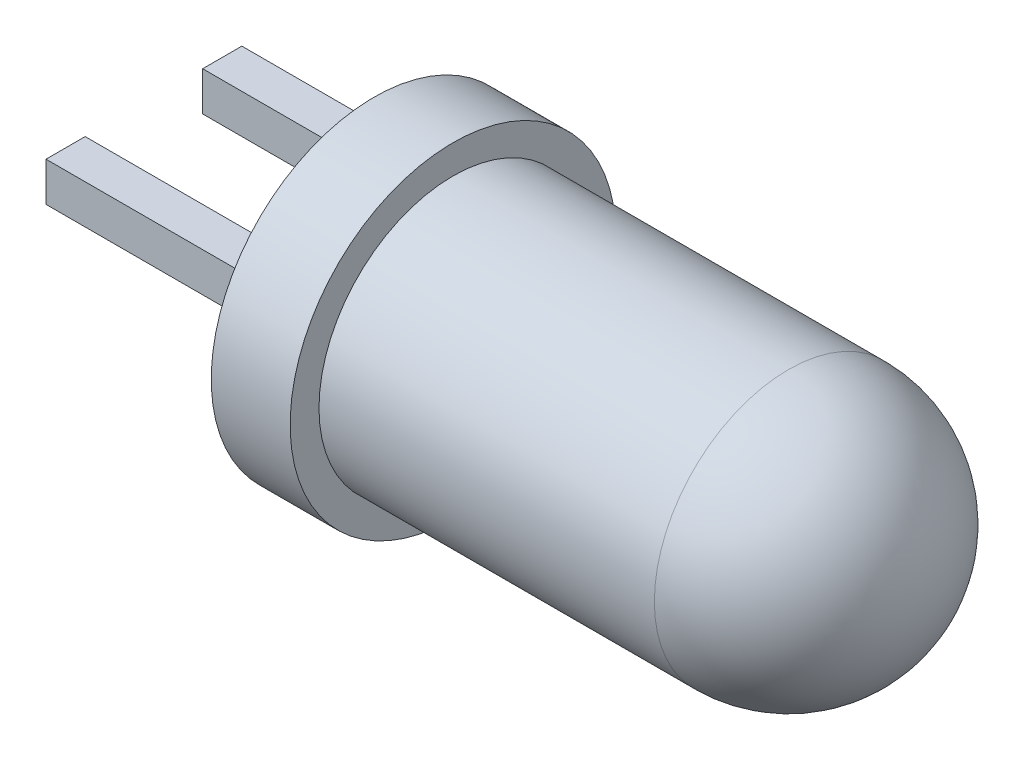
ISO-10303-21;
HEADER;
FILE_DESCRIPTION(('STEP AP214'),'2;1');
FILE_NAME('part.step','',(''),(''),'','','');
FILE_SCHEMA(('AUTOMOTIVE_DESIGN { 1 0 10303 214 1 1 1 1 }'));
ENDSEC;
DATA;
#1=APPLICATION_CONTEXT('core data for automotive mechanical design processes');
#2=APPLICATION_PROTOCOL_DEFINITION('international standard','automotive_design',2000,#1);
#3=PRODUCT_CONTEXT('',#1,'mechanical');
#4=PRODUCT('Part','Part','',(#3));
#5=PRODUCT_RELATED_PRODUCT_CATEGORY('part','',(#4));
#6=PRODUCT_DEFINITION_FORMATION('','',#4);
#7=PRODUCT_DEFINITION_CONTEXT('part definition',#1,'design');
#8=PRODUCT_DEFINITION('design','',#6,#7);
#9=PRODUCT_DEFINITION_SHAPE('','',#8);
#10=(LENGTH_UNIT() NAMED_UNIT(*) SI_UNIT(.MILLI.,.METRE.));
#11=(NAMED_UNIT(*) PLANE_ANGLE_UNIT() SI_UNIT($,.RADIAN.));
#12=(NAMED_UNIT(*) SI_UNIT($,.STERADIAN.) SOLID_ANGLE_UNIT());
#13=UNCERTAINTY_MEASURE_WITH_UNIT(LENGTH_MEASURE(1.E-05),#10,'distance_accuracy_value','');
#14=(GEOMETRIC_REPRESENTATION_CONTEXT(3) GLOBAL_UNCERTAINTY_ASSIGNED_CONTEXT((#13)) GLOBAL_UNIT_ASSIGNED_CONTEXT((#10,
#11,#12)) REPRESENTATION_CONTEXT('',''));
#15=CARTESIAN_POINT('',(0.,0.,0.));
#16=DIRECTION('',(0.,0.,1.));
#17=DIRECTION('',(1.,0.,0.));
#18=AXIS2_PLACEMENT_3D('',#15,#16,#17);
#19=CARTESIAN_POINT('',(41.556948453361,127.506480985467,119.215722179506));
#20=DIRECTION('',(1.,0.,0.));
#21=DIRECTION('',(0.,-1.,0.));
#22=AXIS2_PLACEMENT_3D('',#19,#20,#21);
#23=SPHERICAL_SURFACE('',#22,1.49907626306919);
#24=CARTESIAN_POINT('',(41.556948453361,127.506480985467,119.215722179506));
#25=DIRECTION('',(1.,0.,0.));
#26=DIRECTION('',(0.,-1.,0.));
#27=AXIS2_PLACEMENT_3D('',#24,#25,#26);
#28=CIRCLE('',#27,1.49907626306919);
#29=CARTESIAN_POINT('',(41.556948453361,127.506480985467,117.716645916437));
#30=VERTEX_POINT('',#29);
#31=CARTESIAN_POINT('',(41.556948453361,129.005557248536,119.215722179506));
#32=VERTEX_POINT('',#31);
#33=EDGE_CURVE('P0_E66',#30,#32,#28,.T.);
#34=ORIENTED_EDGE('',*,*,#33,.T.);
#35=CARTESIAN_POINT('',(41.556948453361,127.506480985467,119.215722179506));
#36=DIRECTION('',(0.,0.,1.));
#37=DIRECTION('',(0.,1.,0.));
#38=AXIS2_PLACEMENT_3D('',#35,#36,#37);
#39=CIRCLE('',#38,1.4990762630692);
#40=CARTESIAN_POINT('',(43.0560247164302,127.506480985467,119.215722179506));
#41=VERTEX_POINT('',#40);
#42=EDGE_CURVE('P0_E11',#41,#32,#39,.T.);
#43=ORIENTED_EDGE('',*,*,#42,.F.);
#44=ORIENTED_EDGE('',*,*,#42,.T.);
#45=CARTESIAN_POINT('',(41.556948453361,127.506480985467,119.215722179506));
#46=DIRECTION('',(1.,0.,0.));
#47=DIRECTION('',(0.,-1.,0.));
#48=AXIS2_PLACEMENT_3D('',#45,#46,#47);
#49=CIRCLE('',#48,1.49907626306919);
#50=EDGE_CURVE('P0_E69',#32,#30,#49,.T.);
#51=ORIENTED_EDGE('',*,*,#50,.T.);
#52=EDGE_LOOP('',(#34,#43,#44,#51));
#53=FACE_BOUND('',#52,.T.);
#54=ADVANCED_FACE('P0_F17',(#53),#23,.T.);
#55=CARTESIAN_POINT('',(36.9246378551164,127.506480985467,120.126510111259));
#56=DIRECTION('',(1.,0.,0.));
#57=DIRECTION('',(0.,1.,0.));
#58=AXIS2_PLACEMENT_3D('',#55,#56,#57);
#59=PLANE('',#58);
#60=CARTESIAN_POINT('',(36.9246378551164,127.506480985467,119.215722179506));
#61=DIRECTION('',(1.,0.,0.));
#62=DIRECTION('',(0.,0.,1.));
#63=AXIS2_PLACEMENT_3D('',#60,#61,#62);
#64=CIRCLE('',#63,1.82157586350626);
#65=CARTESIAN_POINT('',(36.9246378551164,127.506480985467,117.394146316));
#66=VERTEX_POINT('',#65);
#67=EDGE_CURVE('P0_E84',#66,#66,#64,.T.);
#68=ORIENTED_EDGE('',*,*,#67,.F.);
#69=EDGE_LOOP('',(#68));
#70=FACE_BOUND('',#69,.T.);
#71=ADVANCED_FACE('P0_F104',(#70),#59,.F.);
#72=CARTESIAN_POINT('',(37.3657203700613,127.506480985467,119.215722179506));
#73=DIRECTION('',(-1.,0.,0.));
#74=DIRECTION('',(0.,0.,1.));
#75=AXIS2_PLACEMENT_3D('',#72,#73,#74);
#76=CYLINDRICAL_SURFACE('',#75,1.82157586350626);
#77=ORIENTED_EDGE('',*,*,#67,.T.);
#78=DIRECTION('',(1.,0.,0.));
#79=VECTOR('',#78,1.);
#80=CARTESIAN_POINT('',(37.3657203700613,127.506480985467,117.394146316));
#81=LINE('',#80,#79);
#82=CARTESIAN_POINT('',(37.8068028850063,127.506480985467,117.394146316));
#83=VERTEX_POINT('',#82);
#84=EDGE_CURVE('P0_E20',#66,#83,#81,.T.);
#85=ORIENTED_EDGE('',*,*,#84,.T.);
#86=CARTESIAN_POINT('',(37.8068028850063,127.506480985467,119.215722179506));
#87=DIRECTION('',(1.,0.,0.));
#88=DIRECTION('',(0.,0.,1.));
#89=AXIS2_PLACEMENT_3D('',#86,#87,#88);
#90=CIRCLE('',#89,1.82157586350626);
#91=EDGE_CURVE('P0_E81',#83,#83,#90,.T.);
#92=ORIENTED_EDGE('',*,*,#91,.F.);
#93=ORIENTED_EDGE('',*,*,#84,.F.);
#94=EDGE_LOOP('',(#77,#85,#92,#93));
#95=FACE_BOUND('',#94,.T.);
#96=ADVANCED_FACE('P0_F92',(#95),#76,.T.);
#97=CARTESIAN_POINT('',(37.8068028850063,127.506480985467,120.876048242794));
#98=DIRECTION('',(-1.,0.,0.));
#99=DIRECTION('',(0.,0.,1.));
#100=AXIS2_PLACEMENT_3D('',#97,#98,#99);
#101=PLANE('',#100);
#102=CARTESIAN_POINT('',(37.8068028850063,127.506480985467,119.215722179506));
#103=DIRECTION('',(1.,0.,0.));
#104=DIRECTION('',(0.,0.,1.));
#105=AXIS2_PLACEMENT_3D('',#102,#103,#104);
#106=CIRCLE('',#105,1.49907626306918);
#107=CARTESIAN_POINT('',(37.8068028850063,127.506480985467,117.716645916437));
#108=VERTEX_POINT('',#107);
#109=EDGE_CURVE('P0_E64',#108,#108,#106,.T.);
#110=ORIENTED_EDGE('',*,*,#109,.F.);
#111=EDGE_LOOP('',(#110));
#112=FACE_BOUND('',#111,.T.);
#113=ORIENTED_EDGE('',*,*,#91,.T.);
#114=EDGE_LOOP('',(#113));
#115=FACE_BOUND('',#114,.T.);
#116=ADVANCED_FACE('P0_F94',(#112,#115),#101,.F.);
#117=CARTESIAN_POINT('',(39.6818756691836,127.506480985467,119.215722179506));
#118=DIRECTION('',(-1.,0.,0.));
#119=DIRECTION('',(0.,0.,1.));
#120=AXIS2_PLACEMENT_3D('',#117,#118,#119);
#121=CYLINDRICAL_SURFACE('',#120,1.49907626306918);
#122=ORIENTED_EDGE('',*,*,#109,.T.);
#123=DIRECTION('',(1.,0.,0.));
#124=VECTOR('',#123,1.);
#125=CARTESIAN_POINT('',(39.6818756691836,127.506480985467,117.716645916437));
#126=LINE('',#125,#124);
#127=EDGE_CURVE('P0_E61',#108,#30,#126,.T.);
#128=ORIENTED_EDGE('',*,*,#127,.T.);
#129=ORIENTED_EDGE('',*,*,#50,.F.);
#130=ORIENTED_EDGE('',*,*,#33,.F.);
#131=ORIENTED_EDGE('',*,*,#127,.F.);
#132=EDGE_LOOP('',(#122,#128,#129,#130,#131));
#133=FACE_BOUND('',#132,.T.);
#134=ADVANCED_FACE('P0_F62',(#133),#121,.T.);
#135=CLOSED_SHELL('',(#54,#71,#96,#116,#134));
#136=MANIFOLD_SOLID_BREP('P0_B1',#135);
#137=CARTESIAN_POINT('',(35.643783620503,127.363942335767,119.800951466132));
#138=DIRECTION('',(0.,-1.,0.));
#139=DIRECTION('',(0.,0.,-1.));
#140=AXIS2_PLACEMENT_3D('',#137,#138,#139);
#141=PLANE('',#140);
#142=DIRECTION('',(1.,0.,0.));
#143=VECTOR('',#142,1.);
#144=CARTESIAN_POINT('',(35.643783620503,127.363942335767,119.687669134371));
#145=LINE('',#144,#143);
#146=CARTESIAN_POINT('',(34.1652583239528,127.363942335767,119.687669134371));
#147=VERTEX_POINT('',#146);
#148=CARTESIAN_POINT('',(38.176257537891,127.363942335767,119.687669134371));
#149=VERTEX_POINT('',#148);
#150=EDGE_CURVE('P1_E11',#147,#149,#145,.T.);
#151=ORIENTED_EDGE('',*,*,#150,.T.);
#152=DIRECTION('',(0.,0.,1.));
#153=VECTOR('',#152,1.);
#154=CARTESIAN_POINT('',(38.176257537891,127.363942335767,119.034528108468));
#155=LINE('',#154,#153);
#156=CARTESIAN_POINT('',(38.176257537891,127.363942335767,119.352734373898));
#157=VERTEX_POINT('',#156);
#158=EDGE_CURVE('P1_E143',#157,#149,#155,.T.);
#159=ORIENTED_EDGE('',*,*,#158,.F.);
#160=DIRECTION('',(-0.772727558068304,0.,-0.634737836434694));
#161=VECTOR('',#160,1.);
#162=CARTESIAN_POINT('',(39.063046113489,127.363942335767,120.08116479672));
#163=LINE('',#162,#161);
#164=CARTESIAN_POINT('',(38.939781138572,127.363942335767,119.97991184842));
#165=VERTEX_POINT('',#164);
#166=EDGE_CURVE('P1_E26',#165,#157,#163,.T.);
#167=ORIENTED_EDGE('',*,*,#166,.F.);
#168=DIRECTION('',(1.,0.,0.));
#169=VECTOR('',#168,1.);
#170=CARTESIAN_POINT('',(38.629471215827,127.363942335767,119.97991184842));
#171=LINE('',#170,#169);
#172=CARTESIAN_POINT('',(39.34696797288,127.363942335767,119.97991184842));
#173=VERTEX_POINT('',#172);
#174=EDGE_CURVE('P1_E109',#165,#173,#171,.T.);
#175=ORIENTED_EDGE('',*,*,#174,.T.);
#176=DIRECTION('',(0.,0.,-1.));
#177=VECTOR('',#176,1.);
#178=CARTESIAN_POINT('',(39.34696797288,127.363942335767,120.528882713542));
#179=LINE('',#178,#177);
#180=CARTESIAN_POINT('',(39.34696797288,127.363942335767,120.382400068216));
#181=VERTEX_POINT('',#180);
#182=EDGE_CURVE('P1_E50',#181,#173,#179,.T.);
#183=ORIENTED_EDGE('',*,*,#182,.F.);
#184=DIRECTION('',(1.,0.,0.));
#185=VECTOR('',#184,1.);
#186=CARTESIAN_POINT('',(38.357006095456,127.363942335767,120.382400068216));
#187=LINE('',#186,#185);
#188=CARTESIAN_POINT('',(38.357006095456,127.363942335767,120.382400068216));
#189=VERTEX_POINT('',#188);
#190=EDGE_CURVE('P1_E106',#189,#181,#187,.T.);
#191=ORIENTED_EDGE('',*,*,#190,.F.);
#192=DIRECTION('',(-0.772727558068304,0.,-0.634737836434694));
#193=VECTOR('',#192,1.);
#194=CARTESIAN_POINT('',(38.480271070373,127.363942335767,120.483653016516));
#195=LINE('',#194,#193);
#196=CARTESIAN_POINT('',(38.044409463769,127.363942335767,120.12562533875));
#197=VERTEX_POINT('',#196);
#198=EDGE_CURVE('P1_E112',#189,#197,#195,.T.);
#199=ORIENTED_EDGE('',*,*,#198,.T.);
#200=DIRECTION('',(1.,0.,0.));
#201=VECTOR('',#200,1.);
#202=CARTESIAN_POINT('',(35.643783620503,127.363942335767,120.12562533875));
#203=LINE('',#202,#201);
#204=CARTESIAN_POINT('',(34.1652583239528,127.363942335767,120.12562533875));
#205=VERTEX_POINT('',#204);
#206=EDGE_CURVE('P1_E137',#205,#197,#203,.T.);
#207=ORIENTED_EDGE('',*,*,#206,.F.);
#208=DIRECTION('',(0.,0.,1.));
#209=VECTOR('',#208,1.);
#210=CARTESIAN_POINT('',(34.1652583239528,127.363942335767,119.963288402441));
#211=LINE('',#210,#209);
#212=EDGE_CURVE('P1_E216',#147,#205,#211,.T.);
#213=ORIENTED_EDGE('',*,*,#212,.F.);
#214=EDGE_LOOP('',(#151,#159,#167,#175,#183,#191,#199,#207,#213));
#215=FACE_BOUND('',#214,.T.);
#216=ADVANCED_FACE('P1_F17',(#215),#141,.T.);
#217=CARTESIAN_POINT('',(36.918952053102,127.582920437956,119.687669134371));
#218=DIRECTION('',(0.,0.,-1.));
#219=DIRECTION('',(0.,-1.,0.));
#220=AXIS2_PLACEMENT_3D('',#217,#218,#219);
#221=PLANE('',#220);
#222=DIRECTION('',(-1.,0.,0.));
#223=VECTOR('',#222,1.);
#224=CARTESIAN_POINT('',(35.643783620503,127.801898540146,119.687669134371));
#225=LINE('',#224,#223);
#226=CARTESIAN_POINT('',(38.176257537891,127.801898540146,119.687669134371));
#227=VERTEX_POINT('',#226);
#228=CARTESIAN_POINT('',(34.1652583239528,127.801898540146,119.687669134371));
#229=VERTEX_POINT('',#228);
#230=EDGE_CURVE('P1_E174',#227,#229,#225,.T.);
#231=ORIENTED_EDGE('',*,*,#230,.F.);
#232=DIRECTION('',(0.,1.,0.));
#233=VECTOR('',#232,1.);
#234=CARTESIAN_POINT('',(38.176257537891,127.582920437956,119.687669134371));
#235=LINE('',#234,#233);
#236=EDGE_CURVE('P1_E147',#149,#227,#235,.T.);
#237=ORIENTED_EDGE('',*,*,#236,.F.);
#238=ORIENTED_EDGE('',*,*,#150,.F.);
#239=DIRECTION('',(0.,-1.,0.));
#240=VECTOR('',#239,1.);
#241=CARTESIAN_POINT('',(34.1652583239528,127.582920437956,119.687669134371));
#242=LINE('',#241,#240);
#243=EDGE_CURVE('P1_E213',#229,#147,#242,.T.);
#244=ORIENTED_EDGE('',*,*,#243,.F.);
#245=EDGE_LOOP('',(#231,#237,#238,#244));
#246=FACE_BOUND('',#245,.T.);
#247=ADVANCED_FACE('P1_F283',(#246),#221,.T.);
#248=CARTESIAN_POINT('',(38.939781138572,127.582920437956,119.97991184842));
#249=DIRECTION('',(0.634737836434694,0.,-0.772727558068304));
#250=DIRECTION('',(0.,-1.,0.));
#251=AXIS2_PLACEMENT_3D('',#248,#249,#250);
#252=PLANE('',#251);
#253=DIRECTION('',(0.,1.,0.));
#254=VECTOR('',#253,1.);
#255=CARTESIAN_POINT('',(38.939781138572,127.582920437956,119.97991184842));
#256=LINE('',#255,#254);
#257=CARTESIAN_POINT('',(38.939781138572,127.801898540146,119.97991184842));
#258=VERTEX_POINT('',#257);
#259=EDGE_CURVE('P1_E153',#165,#258,#256,.T.);
#260=ORIENTED_EDGE('',*,*,#259,.F.);
#261=ORIENTED_EDGE('',*,*,#166,.T.);
#262=DIRECTION('',(0.,1.,0.));
#263=VECTOR('',#262,1.);
#264=CARTESIAN_POINT('',(38.176257537891,127.582920437956,119.352734373898));
#265=LINE('',#264,#263);
#266=CARTESIAN_POINT('',(38.176257537891,127.801898540146,119.352734373898));
#267=VERTEX_POINT('',#266);
#268=EDGE_CURVE('P1_E122',#157,#267,#265,.T.);
#269=ORIENTED_EDGE('',*,*,#268,.T.);
#270=DIRECTION('',(-0.772727558068304,0.,-0.634737836434694));
#271=VECTOR('',#270,1.);
#272=CARTESIAN_POINT('',(39.063046113489,127.801898540146,120.08116479672));
#273=LINE('',#272,#271);
#274=EDGE_CURVE('P1_E175',#258,#267,#273,.T.);
#275=ORIENTED_EDGE('',*,*,#274,.F.);
#276=EDGE_LOOP('',(#260,#261,#269,#275));
#277=FACE_BOUND('',#276,.T.);
#278=ADVANCED_FACE('P1_F19',(#277),#252,.T.);
#279=CARTESIAN_POINT('',(39.34696797288,127.582920437956,119.97991184842));
#280=DIRECTION('',(1.,0.,0.));
#281=DIRECTION('',(0.,1.,0.));
#282=AXIS2_PLACEMENT_3D('',#279,#280,#281);
#283=PLANE('',#282);
#284=DIRECTION('',(0.,-1.,0.));
#285=VECTOR('',#284,1.);
#286=CARTESIAN_POINT('',(39.34696797288,127.582920437956,119.97991184842));
#287=LINE('',#286,#285);
#288=CARTESIAN_POINT('',(39.34696797288,127.801898540146,119.97991184842));
#289=VERTEX_POINT('',#288);
#290=EDGE_CURVE('P1_E148',#289,#173,#287,.T.);
#291=ORIENTED_EDGE('',*,*,#290,.F.);
#292=DIRECTION('',(0.,0.,-1.));
#293=VECTOR('',#292,1.);
#294=CARTESIAN_POINT('',(39.34696797288,127.801898540146,120.528882713542));
#295=LINE('',#294,#293);
#296=CARTESIAN_POINT('',(39.34696797288,127.801898540146,120.382400068216));
#297=VERTEX_POINT('',#296);
#298=EDGE_CURVE('P1_E126',#297,#289,#295,.T.);
#299=ORIENTED_EDGE('',*,*,#298,.F.);
#300=DIRECTION('',(0.,1.,0.));
#301=VECTOR('',#300,1.);
#302=CARTESIAN_POINT('',(39.34696797288,127.582920437956,120.382400068216));
#303=LINE('',#302,#301);
#304=EDGE_CURVE('P1_E117',#181,#297,#303,.T.);
#305=ORIENTED_EDGE('',*,*,#304,.F.);
#306=ORIENTED_EDGE('',*,*,#182,.T.);
#307=EDGE_LOOP('',(#291,#299,#305,#306));
#308=FACE_BOUND('',#307,.T.);
#309=ADVANCED_FACE('P1_F124',(#308),#283,.T.);
#310=CARTESIAN_POINT('',(38.357006095456,127.582920437956,120.382400068216));
#311=DIRECTION('',(-0.634737836434694,0.,0.772727558068304));
#312=DIRECTION('',(0.,1.,0.));
#313=AXIS2_PLACEMENT_3D('',#310,#311,#312);
#314=PLANE('',#313);
#315=DIRECTION('',(0.,-1.,0.));
#316=VECTOR('',#315,1.);
#317=CARTESIAN_POINT('',(38.357006095456,127.582920437956,120.382400068216));
#318=LINE('',#317,#316);
#319=CARTESIAN_POINT('',(38.357006095456,127.801898540146,120.382400068216));
#320=VERTEX_POINT('',#319);
#321=EDGE_CURVE('P1_E120',#320,#189,#318,.T.);
#322=ORIENTED_EDGE('',*,*,#321,.F.);
#323=DIRECTION('',(-0.772727558068304,0.,-0.634737836434694));
#324=VECTOR('',#323,1.);
#325=CARTESIAN_POINT('',(38.480271070373,127.801898540146,120.483653016516));
#326=LINE('',#325,#324);
#327=CARTESIAN_POINT('',(38.044409463769,127.801898540146,120.12562533875));
#328=VERTEX_POINT('',#327);
#329=EDGE_CURVE('P1_E222',#320,#328,#326,.T.);
#330=ORIENTED_EDGE('',*,*,#329,.T.);
#331=DIRECTION('',(0.,1.,0.));
#332=VECTOR('',#331,1.);
#333=CARTESIAN_POINT('',(38.044409463769,127.582920437956,120.12562533875));
#334=LINE('',#333,#332);
#335=EDGE_CURVE('P1_E129',#197,#328,#334,.T.);
#336=ORIENTED_EDGE('',*,*,#335,.F.);
#337=ORIENTED_EDGE('',*,*,#198,.F.);
#338=EDGE_LOOP('',(#322,#330,#336,#337));
#339=FACE_BOUND('',#338,.T.);
#340=ADVANCED_FACE('P1_F272',(#339),#314,.T.);
#341=CARTESIAN_POINT('',(39.34696797288,127.582920437956,119.97991184842));
#342=DIRECTION('',(0.,0.,-1.));
#343=DIRECTION('',(0.,-1.,0.));
#344=AXIS2_PLACEMENT_3D('',#341,#342,#343);
#345=PLANE('',#344);
#346=ORIENTED_EDGE('',*,*,#290,.T.);
#347=ORIENTED_EDGE('',*,*,#174,.F.);
#348=ORIENTED_EDGE('',*,*,#259,.T.);
#349=DIRECTION('',(1.,0.,0.));
#350=VECTOR('',#349,1.);
#351=CARTESIAN_POINT('',(38.629471215827,127.801898540146,119.97991184842));
#352=LINE('',#351,#350);
#353=EDGE_CURVE('P1_E181',#258,#289,#352,.T.);
#354=ORIENTED_EDGE('',*,*,#353,.T.);
#355=EDGE_LOOP('',(#346,#347,#348,#354));
#356=FACE_BOUND('',#355,.T.);
#357=ADVANCED_FACE('P1_F303',(#356),#345,.T.);
#358=CARTESIAN_POINT('',(38.176257537891,127.582920437956,119.352734373898));
#359=DIRECTION('',(-1.,0.,0.));
#360=DIRECTION('',(0.,0.,1.));
#361=AXIS2_PLACEMENT_3D('',#358,#359,#360);
#362=PLANE('',#361);
#363=ORIENTED_EDGE('',*,*,#268,.F.);
#364=ORIENTED_EDGE('',*,*,#158,.T.);
#365=ORIENTED_EDGE('',*,*,#236,.T.);
#366=DIRECTION('',(0.,0.,1.));
#367=VECTOR('',#366,1.);
#368=CARTESIAN_POINT('',(38.176257537891,127.801898540146,119.034528108468));
#369=LINE('',#368,#367);
#370=EDGE_CURVE('P1_E169',#267,#227,#369,.T.);
#371=ORIENTED_EDGE('',*,*,#370,.F.);
#372=EDGE_LOOP('',(#363,#364,#365,#371));
#373=FACE_BOUND('',#372,.T.);
#374=ADVANCED_FACE('P1_F167',(#373),#362,.T.);
#375=CARTESIAN_POINT('',(39.34696797288,127.582920437956,120.382400068216));
#376=DIRECTION('',(0.,0.,1.));
#377=DIRECTION('',(1.,0.,0.));
#378=AXIS2_PLACEMENT_3D('',#375,#376,#377);
#379=PLANE('',#378);
#380=ORIENTED_EDGE('',*,*,#304,.T.);
#381=DIRECTION('',(1.,0.,0.));
#382=VECTOR('',#381,1.);
#383=CARTESIAN_POINT('',(38.357006095456,127.801898540146,120.382400068216));
#384=LINE('',#383,#382);
#385=EDGE_CURVE('P1_E225',#320,#297,#384,.T.);
#386=ORIENTED_EDGE('',*,*,#385,.F.);
#387=ORIENTED_EDGE('',*,*,#321,.T.);
#388=ORIENTED_EDGE('',*,*,#190,.T.);
#389=EDGE_LOOP('',(#380,#386,#387,#388));
#390=FACE_BOUND('',#389,.T.);
#391=ADVANCED_FACE('P1_F115',(#390),#379,.T.);
#392=CARTESIAN_POINT('',(38.044409463769,127.582920437956,120.12562533875));
#393=DIRECTION('',(0.,0.,1.));
#394=DIRECTION('',(1.,0.,0.));
#395=AXIS2_PLACEMENT_3D('',#392,#393,#394);
#396=PLANE('',#395);
#397=ORIENTED_EDGE('',*,*,#206,.T.);
#398=ORIENTED_EDGE('',*,*,#335,.T.);
#399=DIRECTION('',(1.,0.,0.));
#400=VECTOR('',#399,1.);
#401=CARTESIAN_POINT('',(35.643783620503,127.801898540146,120.12562533875));
#402=LINE('',#401,#400);
#403=CARTESIAN_POINT('',(34.1652583239528,127.801898540146,120.12562533875));
#404=VERTEX_POINT('',#403);
#405=EDGE_CURVE('P1_E221',#404,#328,#402,.T.);
#406=ORIENTED_EDGE('',*,*,#405,.F.);
#407=DIRECTION('',(0.,1.,0.));
#408=VECTOR('',#407,1.);
#409=CARTESIAN_POINT('',(34.1652583239528,127.582920437956,120.12562533875));
#410=LINE('',#409,#408);
#411=EDGE_CURVE('P1_E205',#205,#404,#410,.T.);
#412=ORIENTED_EDGE('',*,*,#411,.F.);
#413=EDGE_LOOP('',(#397,#398,#406,#412));
#414=FACE_BOUND('',#413,.T.);
#415=ADVANCED_FACE('P1_F269',(#414),#396,.T.);
#416=CARTESIAN_POINT('',(35.643783620503,127.801898540146,119.800951466132));
#417=DIRECTION('',(0.,-1.,0.));
#418=DIRECTION('',(0.,0.,-1.));
#419=AXIS2_PLACEMENT_3D('',#416,#417,#418);
#420=PLANE('',#419);
#421=ORIENTED_EDGE('',*,*,#405,.T.);
#422=ORIENTED_EDGE('',*,*,#329,.F.);
#423=ORIENTED_EDGE('',*,*,#385,.T.);
#424=ORIENTED_EDGE('',*,*,#298,.T.);
#425=ORIENTED_EDGE('',*,*,#353,.F.);
#426=ORIENTED_EDGE('',*,*,#274,.T.);
#427=ORIENTED_EDGE('',*,*,#370,.T.);
#428=ORIENTED_EDGE('',*,*,#230,.T.);
#429=DIRECTION('',(0.,0.,-1.));
#430=VECTOR('',#429,1.);
#431=CARTESIAN_POINT('',(34.1652583239528,127.801898540146,119.963288402441));
#432=LINE('',#431,#430);
#433=EDGE_CURVE('P1_E209',#404,#229,#432,.T.);
#434=ORIENTED_EDGE('',*,*,#433,.F.);
#435=EDGE_LOOP('',(#421,#422,#423,#424,#425,#426,#427,#428,#434));
#436=FACE_BOUND('',#435,.T.);
#437=ADVANCED_FACE('P1_F179',(#436),#420,.F.);
#438=CARTESIAN_POINT('',(34.1652583239528,127.582920437956,120.12562533875));
#439=DIRECTION('',(-1.,0.,0.));
#440=DIRECTION('',(0.,0.,1.));
#441=AXIS2_PLACEMENT_3D('',#438,#439,#440);
#442=PLANE('',#441);
#443=ORIENTED_EDGE('',*,*,#411,.T.);
#444=ORIENTED_EDGE('',*,*,#433,.T.);
#445=ORIENTED_EDGE('',*,*,#243,.T.);
#446=ORIENTED_EDGE('',*,*,#212,.T.);
#447=EDGE_LOOP('',(#443,#444,#445,#446));
#448=FACE_BOUND('',#447,.T.);
#449=ADVANCED_FACE('P1_F281',(#448),#442,.T.);
#450=CLOSED_SHELL('',(#216,#247,#278,#309,#340,#357,#374,#391,#415,#437,#449));
#451=MANIFOLD_SOLID_BREP('P1_B1',#450);
#452=CARTESIAN_POINT('',(34.1652583239528,127.582920437956,120.12562533875));
#453=DIRECTION('',(-1.,0.,0.));
#454=DIRECTION('',(0.,0.,1.));
#455=AXIS2_PLACEMENT_3D('',#452,#453,#454);
#456=PLANE('',#455);
#457=DIRECTION('',(0.,1.,0.));
#458=VECTOR('',#457,1.);
#459=CARTESIAN_POINT('',(34.1652583239528,127.582920437956,118.373800521232));
#460=LINE('',#459,#458);
#461=CARTESIAN_POINT('',(34.1652583239528,127.363942335767,118.373800521232));
#462=VERTEX_POINT('',#461);
#463=CARTESIAN_POINT('',(34.1652583239528,127.801898540146,118.373800521232));
#464=VERTEX_POINT('',#463);
#465=EDGE_CURVE('P2_E11',#462,#464,#460,.T.);
#466=ORIENTED_EDGE('',*,*,#465,.T.);
#467=DIRECTION('',(0.,0.,-1.));
#468=VECTOR('',#467,1.);
#469=CARTESIAN_POINT('',(34.1652583239528,127.801898540146,119.087375993682));
#470=LINE('',#469,#468);
#471=CARTESIAN_POINT('',(34.1652583239528,127.801898540146,117.935844316853));
#472=VERTEX_POINT('',#471);
#473=EDGE_CURVE('P2_E127',#464,#472,#470,.T.);
#474=ORIENTED_EDGE('',*,*,#473,.T.);
#475=DIRECTION('',(0.,-1.,0.));
#476=VECTOR('',#475,1.);
#477=CARTESIAN_POINT('',(34.1652583239528,127.582920437956,117.935844316853));
#478=LINE('',#477,#476);
#479=CARTESIAN_POINT('',(34.1652583239528,127.363942335767,117.935844316853));
#480=VERTEX_POINT('',#479);
#481=EDGE_CURVE('P2_E177',#472,#480,#478,.T.);
#482=ORIENTED_EDGE('',*,*,#481,.T.);
#483=DIRECTION('',(0.,0.,1.));
#484=VECTOR('',#483,1.);
#485=CARTESIAN_POINT('',(34.1652583239528,127.363942335767,119.087375993682));
#486=LINE('',#485,#484);
#487=EDGE_CURVE('P2_E170',#480,#462,#486,.T.);
#488=ORIENTED_EDGE('',*,*,#487,.T.);
#489=EDGE_LOOP('',(#466,#474,#482,#488));
#490=FACE_BOUND('',#489,.T.);
#491=ADVANCED_FACE('P2_F17',(#490),#456,.T.);
#492=CARTESIAN_POINT('',(35.123009343903,127.363942335767,118.373800521232));
#493=DIRECTION('',(0.,0.,1.));
#494=DIRECTION('',(1.,0.,0.));
#495=AXIS2_PLACEMENT_3D('',#492,#493,#494);
#496=PLANE('',#495);
#497=DIRECTION('',(-1.,0.,0.));
#498=VECTOR('',#497,1.);
#499=CARTESIAN_POINT('',(35.123009343903,127.801898540146,118.373800521232));
#500=LINE('',#499,#498);
#501=CARTESIAN_POINT('',(38.176257537891,127.801898540146,118.373800521232));
#502=VERTEX_POINT('',#501);
#503=EDGE_CURVE('P2_E26',#502,#464,#500,.T.);
#504=ORIENTED_EDGE('',*,*,#503,.T.);
#505=ORIENTED_EDGE('',*,*,#465,.F.);
#506=DIRECTION('',(1.,0.,0.));
#507=VECTOR('',#506,1.);
#508=CARTESIAN_POINT('',(36.629185080357,127.363942335767,118.373800521232));
#509=LINE('',#508,#507);
#510=CARTESIAN_POINT('',(38.176257537891,127.363942335767,118.373800521232));
#511=VERTEX_POINT('',#510);
#512=EDGE_CURVE('P2_E144',#462,#511,#509,.T.);
#513=ORIENTED_EDGE('',*,*,#512,.T.);
#514=DIRECTION('',(0.,-1.,0.));
#515=VECTOR('',#514,1.);
#516=CARTESIAN_POINT('',(38.176257537891,127.582920437956,118.373800521232));
#517=LINE('',#516,#515);
#518=EDGE_CURVE('P2_E136',#502,#511,#517,.T.);
#519=ORIENTED_EDGE('',*,*,#518,.F.);
#520=EDGE_LOOP('',(#504,#505,#513,#519));
#521=FACE_BOUND('',#520,.T.);
#522=ADVANCED_FACE('P2_F19',(#521),#496,.T.);
#523=CARTESIAN_POINT('',(35.123009343903,127.801898540146,118.373800521232));
#524=DIRECTION('',(0.,1.,0.));
#525=DIRECTION('',(1.,0.,0.));
#526=AXIS2_PLACEMENT_3D('',#523,#524,#525);
#527=PLANE('',#526);
#528=DIRECTION('',(-1.,0.,0.));
#529=VECTOR('',#528,1.);
#530=CARTESIAN_POINT('',(35.123009343903,127.801898540146,117.935844316853));
#531=LINE('',#530,#529);
#532=CARTESIAN_POINT('',(38.429623073374,127.801898540146,117.935844316853));
#533=VERTEX_POINT('',#532);
#534=EDGE_CURVE('P2_E179',#533,#472,#531,.T.);
#535=ORIENTED_EDGE('',*,*,#534,.T.);
#536=ORIENTED_EDGE('',*,*,#473,.F.);
#537=ORIENTED_EDGE('',*,*,#503,.F.);
#538=DIRECTION('',(0.,0.,-1.));
#539=VECTOR('',#538,1.);
#540=CARTESIAN_POINT('',(38.176257537891,127.801898540146,119.034528108468));
#541=LINE('',#540,#539);
#542=CARTESIAN_POINT('',(38.176257537891,127.801898540146,119.034528108468));
#543=VERTEX_POINT('',#542);
#544=EDGE_CURVE('P2_E125',#543,#502,#541,.T.);
#545=ORIENTED_EDGE('',*,*,#544,.F.);
#546=DIRECTION('',(-0.772727558068304,0.,-0.634737836434694));
#547=VECTOR('',#546,1.);
#548=CARTESIAN_POINT('',(39.063046113489,127.801898540146,119.76295853129));
#549=LINE('',#548,#547);
#550=CARTESIAN_POINT('',(38.972652930809,127.801898540146,119.68870729927));
#551=VERTEX_POINT('',#550);
#552=EDGE_CURVE('P2_E210',#551,#543,#549,.T.);
#553=ORIENTED_EDGE('',*,*,#552,.F.);
#554=DIRECTION('',(-1.,0.,0.));
#555=VECTOR('',#554,1.);
#556=CARTESIAN_POINT('',(39.692445571535,127.801898540146,119.68870729927));
#557=LINE('',#556,#555);
#558=CARTESIAN_POINT('',(39.063046113489,127.801898540146,119.68870729927));
#559=VERTEX_POINT('',#558);
#560=EDGE_CURVE('P2_E234',#559,#551,#557,.T.);
#561=ORIENTED_EDGE('',*,*,#560,.F.);
#562=DIRECTION('',(0.,0.,-1.));
#563=VECTOR('',#562,1.);
#564=CARTESIAN_POINT('',(39.063046113489,127.801898540146,120.050696124541));
#565=LINE('',#564,#563);
#566=CARTESIAN_POINT('',(39.063046113489,127.801898540146,119.441269270757));
#567=VERTEX_POINT('',#566);
#568=EDGE_CURVE('P2_E164',#559,#567,#565,.T.);
#569=ORIENTED_EDGE('',*,*,#568,.T.);
#570=CARTESIAN_POINT('',(39.063046113489,127.801898540146,119.441269270757));
#571=CARTESIAN_POINT('',(39.050311589243,127.801898540146,119.421479795793));
#572=CARTESIAN_POINT('',(39.037693101015,127.801898540146,119.401616193594));
#573=CARTESIAN_POINT('',(39.025243683415,127.801898540146,119.381647656845));
#574=CARTESIAN_POINT('',(39.01901891558,127.801898540146,119.371663293782));
#575=CARTESIAN_POINT('',(39.012837129213,127.801898540146,119.361653085094));
#576=CARTESIAN_POINT('',(39.00670591019,127.801898540146,119.351608275032));
#577=CARTESIAN_POINT('',(39.000574859648,127.801898540146,119.341563740991));
#578=CARTESIAN_POINT('',(38.994495220536,127.801898540146,119.331486086476));
#579=CARTESIAN_POINT('',(38.988480543401,127.801898540146,119.321370020137));
#580=CARTESIAN_POINT('',(38.982465865341,127.801898540146,119.311253952243));
#581=CARTESIAN_POINT('',(38.976516025587,127.801898540146,119.301099453025));
#582=CARTESIAN_POINT('',(38.970648292664,127.801898540146,119.290898808406));
#583=CARTESIAN_POINT('',(38.964780566557,127.801898540146,119.280698175635));
#584=CARTESIAN_POINT('',(38.958994748791,127.801898540142,119.270451328154));
#585=CARTESIAN_POINT('',(38.953313531937,127.801898540142,119.260147596299));
#586=CARTESIAN_POINT('',(38.947631180837,127.801898540142,119.249841807318));
#587=CARTESIAN_POINT('',(38.942058329753,127.801898540146,119.239488884258));
#588=CARTESIAN_POINT('',(38.936609391134,127.801898540146,119.229043415336));
#589=CARTESIAN_POINT('',(38.931160791815,127.801898540146,119.218598596843));
#590=CARTESIAN_POINT('',(38.925840397675,127.801898540146,119.208069079868));
#591=CARTESIAN_POINT('',(38.920699444231,127.801898540146,119.197453058973));
#592=CARTESIAN_POINT('',(38.91689472008,127.801898540146,119.189596339101));
#593=CARTESIAN_POINT('',(38.913188333252,127.801898540146,119.181691920312));
#594=CARTESIAN_POINT('',(38.90960511872,127.801898540146,119.173736207456));
#595=CARTESIAN_POINT('',(38.906021904729,127.801898540146,119.165780495798));
#596=CARTESIAN_POINT('',(38.90256170995,127.801898540146,119.157773295838));
#597=CARTESIAN_POINT('',(38.899254009832,127.801898540146,119.149708688043));
#598=CARTESIAN_POINT('',(38.895946323304,127.801898540146,119.141644113379));
#599=CARTESIAN_POINT('',(38.892790964842,127.801898540146,119.133521811997));
#600=CARTESIAN_POINT('',(38.889823168266,127.801898540146,119.125334289715));
#601=CARTESIAN_POINT('',(38.886854782648,127.801898540146,119.117145142389));
#602=CARTESIAN_POINT('',(38.884076244545,127.801898540146,119.108897802903));
#603=CARTESIAN_POINT('',(38.881522536696,127.801898540146,119.100563481123));
#604=CARTESIAN_POINT('',(38.878967200152,127.801898540146,119.092223843913));
#605=CARTESIAN_POINT('',(38.876632525664,127.801898540146,119.083778803182));
#606=CARTESIAN_POINT('',(38.874577009152,127.801898540146,119.075251658932));
#607=CARTESIAN_POINT('',(38.872521505188,127.801898540146,119.066724566732));
#608=CARTESIAN_POINT('',(38.870745934128,127.801898540146,119.058115944967));
#609=CARTESIAN_POINT('',(38.869301995718,127.801898540146,119.049455135421));
#610=CARTESIAN_POINT('',(38.867858044667,127.801898540146,119.040794250053));
#611=CARTESIAN_POINT('',(38.866746685317,127.801898540146,119.032082980068));
#612=CARTESIAN_POINT('',(38.86600228884,127.801898540146,119.023355066517));
#613=CARTESIAN_POINT('',(38.865257871499,127.801898540146,119.014626908329));
#614=CARTESIAN_POINT('',(38.864880953069,127.801898540146,119.00588517257));
#615=CARTESIAN_POINT('',(38.864880295663,127.801898540146,118.997160993989));
#616=CARTESIAN_POINT('',(38.864879638129,127.801898540146,118.988435118531));
#617=CARTESIAN_POINT('',(38.865254072485,127.801898540144,118.979737686817));
#618=CARTESIAN_POINT('',(38.865990897156,127.801898540144,118.971054825939));
#619=CARTESIAN_POINT('',(38.866727643148,127.801898540144,118.962372892229));
#620=CARTESIAN_POINT('',(38.86782665943,127.801898540146,118.953712588111));
#621=CARTESIAN_POINT('',(38.869257273233,127.801898540146,118.945089756004));
#622=CARTESIAN_POINT('',(38.870687856574,127.801898540146,118.936467107496));
#623=CARTESIAN_POINT('',(38.872449355308,127.801898540146,118.927883385274));
#624=CARTESIAN_POINT('',(38.874497490931,127.801898540146,118.91935482648));
#625=CARTESIAN_POINT('',(38.876545612104,127.801898540146,118.910826327851));
#626=CARTESIAN_POINT('',(38.87887978341,127.801898540146,118.902353496903));
#627=CARTESIAN_POINT('',(38.881449623445,127.801898540146,118.89395069403));
#628=CARTESIAN_POINT('',(38.886589148352,127.801898540146,118.877145595632));
#629=CARTESIAN_POINT('',(38.892668037418,127.801898540144,118.860618464975));
#630=CARTESIAN_POINT('',(38.8992904318,127.801898540144,118.844478517735));
#631=CARTESIAN_POINT('',(38.902599512657,127.801898540144,118.836413701996));
#632=CARTESIAN_POINT('',(38.906052276411,127.801898540146,118.828426572507));
#633=CARTESIAN_POINT('',(38.909629810589,127.801898540146,118.820484964982));
#634=CARTESIAN_POINT('',(38.9132065255,127.801898540146,118.812545176113));
#635=CARTESIAN_POINT('',(38.916904761177,127.801898540146,118.804658814064));
#636=CARTESIAN_POINT('',(38.92070176356,127.801898540146,118.796818141628));
#637=CARTESIAN_POINT('',(38.925832312265,127.801898540146,118.786223744325));
#638=CARTESIAN_POINT('',(38.931143064013,127.801898540146,118.775712161822));
#639=CARTESIAN_POINT('',(38.936590135432,127.801898540146,118.765269488674));
#640=CARTESIAN_POINT('',(38.942037209785,127.801898540146,118.754826809901));
#641=CARTESIAN_POINT('',(38.947621029969,127.801898540146,118.744452766847));
#642=CARTESIAN_POINT('',(38.953307557473,127.801898540146,118.734139229374));
#643=CARTESIAN_POINT('',(38.95899421443,127.801898540146,118.723825457115));
#644=CARTESIAN_POINT('',(38.964783216567,127.801898540146,118.713573193049));
#645=CARTESIAN_POINT('',(38.970648961766,127.801898540146,118.703376018371));
#646=CARTESIAN_POINT('',(38.97651561992,127.801898540146,118.693177256585));
#647=CARTESIAN_POINT('',(38.982463884864,127.80189854014,118.683025425281));
#648=CARTESIAN_POINT('',(38.988477096587,127.80189854014,118.67291176697));
#649=CARTESIAN_POINT('',(38.994490315934,127.80189854014,118.662798095835));
#650=CARTESIAN_POINT('',(39.000568614503,127.801898540146,118.652722564692));
#651=CARTESIAN_POINT('',(39.006699342499,127.801898540146,118.642678474864));
#652=CARTESIAN_POINT('',(39.012830072307,127.801898540146,118.632634382066));
#653=CARTESIAN_POINT('',(39.019013317998,127.80189854014,118.622621719936));
#654=CARTESIAN_POINT('',(39.025239231487,127.80189854014,118.612635473853));
#655=CARTESIAN_POINT('',(39.037691004508,127.80189854014,118.592663068234));
#656=CARTESIAN_POINT('',(39.05031230759,127.801898540146,118.572795077862));
#657=CARTESIAN_POINT('',(39.063046113489,127.801898540146,118.553006719205));
#658=(BOUNDED_CURVE() B_SPLINE_CURVE(3,(#570,#571,#572,#573,#574,#575,#576,#577,#578,#579,#580,
#581,#582,#583,#584,#585,#586,#587,#588,#589,#590,#591,#592,#593,#594,#595,#596,#597,#598,#599,
#600,#601,#602,#603,#604,#605,#606,#607,#608,#609,#610,#611,#612,#613,#614,#615,#616,#617,#618,
#619,#620,#621,#622,#623,#624,#625,#626,#627,#628,#629,#630,#631,#632,#633,#634,#635,#636,#637,
#638,#639,#640,#641,#642,#643,#644,#645,#646,#647,#648,#649,#650,#651,#652,#653,#654,#655,#656,
#657),.UNSPECIFIED.,.F.,.F.) B_SPLINE_CURVE_WITH_KNOTS((4,3,3,3,3,3,3,3,3,3,3,3,3,3,3,3,3,3,3,3,
3,3,3,3,3,3,3,3,3,4),(0.,0.0705963566748156,0.105895404745114,0.141201637170539,
0.176507521523638,0.21180858432904,0.247115151845423,0.282487031582664,0.308671325535496,
0.334834905515289,0.360972043927355,0.387099386995554,0.413350879184088,0.439686795964307,
0.466001658568426,0.492227645602998,0.518365244728685,0.54454189866202,0.570810483528647,
0.597152807283197,0.649762372643509,0.67589011004098,0.702019603429619,0.73734452728811,
0.772680355644012,0.807995133985515,0.843292932002588,0.878593302882744,0.913896542080532,
0.984501313614097),
.UNSPECIFIED.) CURVE() GEOMETRIC_REPRESENTATION_ITEM() RATIONAL_B_SPLINE_CURVE((1.,1.,1.,1.,1.,
1.,1.,1.,1.,1.,1.,1.,1.,1.,1.,1.,1.,1.,1.,1.,1.,1.,1.,1.,1.,1.,1.,1.,1.,1.,1.,1.,1.,1.,1.,1.,1.,
1.,1.,1.,1.,1.,1.,1.,1.,1.,1.,1.,1.,1.,1.,1.,1.,1.,1.,1.,1.,1.,1.,1.,1.,1.,1.,1.,1.,1.,1.,1.,1.,
1.,1.,1.,1.,1.,1.,1.,1.,1.,1.,1.,1.,1.,1.,1.,1.,1.,1.,1.)) REPRESENTATION_ITEM(''));
#659=CARTESIAN_POINT('',(39.063046113489,127.801898540146,118.553006719205));
#660=VERTEX_POINT('',#659);
#661=EDGE_CURVE('P2_E199',#567,#660,#658,.T.);
#662=ORIENTED_EDGE('',*,*,#661,.T.);
#663=DIRECTION('',(0.,0.,-1.));
#664=VECTOR('',#663,1.);
#665=CARTESIAN_POINT('',(39.063046113489,127.801898540146,120.050696124541));
#666=LINE('',#665,#664);
#667=CARTESIAN_POINT('',(39.063046113489,127.801898540146,118.305568690692));
#668=VERTEX_POINT('',#667);
#669=EDGE_CURVE('P2_E161',#660,#668,#666,.T.);
#670=ORIENTED_EDGE('',*,*,#669,.T.);
#671=DIRECTION('',(0.863643807025926,0.,0.504102543720784));
#672=VECTOR('',#671,1.);
#673=CARTESIAN_POINT('',(38.038829407062,127.801898540146,117.707740925552));
#674=LINE('',#673,#672);
#675=EDGE_CURVE('P2_E209',#533,#668,#674,.T.);
#676=ORIENTED_EDGE('',*,*,#675,.F.);
#677=EDGE_LOOP('',(#535,#536,#537,#545,#553,#561,#569,#662,#670,#676));
#678=FACE_BOUND('',#677,.T.);
#679=ADVANCED_FACE('P2_F123',(#678),#527,.T.);
#680=CARTESIAN_POINT('',(35.123009343903,127.801898540146,117.935844316853));
#681=DIRECTION('',(0.,0.,-1.));
#682=DIRECTION('',(0.,-1.,0.));
#683=AXIS2_PLACEMENT_3D('',#680,#681,#682);
#684=PLANE('',#683);
#685=DIRECTION('',(-1.,0.,0.));
#686=VECTOR('',#685,1.);
#687=CARTESIAN_POINT('',(35.123009343903,127.363942335767,117.935844316853));
#688=LINE('',#687,#686);
#689=CARTESIAN_POINT('',(38.429623073374,127.363942335767,117.935844316853));
#690=VERTEX_POINT('',#689);
#691=EDGE_CURVE('P2_E173',#690,#480,#688,.T.);
#692=ORIENTED_EDGE('',*,*,#691,.T.);
#693=ORIENTED_EDGE('',*,*,#481,.F.);
#694=ORIENTED_EDGE('',*,*,#534,.F.);
#695=DIRECTION('',(0.,1.,0.));
#696=VECTOR('',#695,1.);
#697=CARTESIAN_POINT('',(38.429623073374,127.582920437956,117.935844316853));
#698=LINE('',#697,#696);
#699=EDGE_CURVE('P2_E205',#690,#533,#698,.T.);
#700=ORIENTED_EDGE('',*,*,#699,.F.);
#701=EDGE_LOOP('',(#692,#693,#694,#700));
#702=FACE_BOUND('',#701,.T.);
#703=ADVANCED_FACE('P2_F347',(#702),#684,.T.);
#704=CARTESIAN_POINT('',(35.123009343903,127.363942335767,117.935844316853));
#705=DIRECTION('',(0.,-1.,0.));
#706=DIRECTION('',(0.,0.,-1.));
#707=AXIS2_PLACEMENT_3D('',#704,#705,#706);
#708=PLANE('',#707);
#709=ORIENTED_EDGE('',*,*,#512,.F.);
#710=ORIENTED_EDGE('',*,*,#487,.F.);
#711=ORIENTED_EDGE('',*,*,#691,.F.);
#712=DIRECTION('',(0.863643807025926,0.,0.504102543720784));
#713=VECTOR('',#712,1.);
#714=CARTESIAN_POINT('',(38.038829407062,127.363942335767,117.707740925552));
#715=LINE('',#714,#713);
#716=CARTESIAN_POINT('',(39.063046113489,127.363942335767,118.305568690692));
#717=VERTEX_POINT('',#716);
#718=EDGE_CURVE('P2_E195',#690,#717,#715,.T.);
#719=ORIENTED_EDGE('',*,*,#718,.T.);
#720=DIRECTION('',(0.,0.,-1.));
#721=VECTOR('',#720,1.);
#722=CARTESIAN_POINT('',(39.063046113489,127.363942335767,120.050696124541));
#723=LINE('',#722,#721);
#724=CARTESIAN_POINT('',(39.063046113489,127.363942335767,118.553006719205));
#725=VERTEX_POINT('',#724);
#726=EDGE_CURVE('P2_E140',#725,#717,#723,.T.);
#727=ORIENTED_EDGE('',*,*,#726,.F.);
#728=CARTESIAN_POINT('',(39.063046113489,127.363942335767,119.441269270757));
#729=CARTESIAN_POINT('',(39.05031230759,127.363942335767,119.4214809121));
#730=CARTESIAN_POINT('',(39.037691004508,127.363942335773,119.401612921729));
#731=CARTESIAN_POINT('',(39.025239231487,127.363942335773,119.38164051611));
#732=CARTESIAN_POINT('',(39.019013317998,127.363942335773,119.371654270027));
#733=CARTESIAN_POINT('',(39.012830072307,127.363942335767,119.361641607896));
#734=CARTESIAN_POINT('',(39.006699342499,127.363942335767,119.351597515098));
#735=CARTESIAN_POINT('',(39.000568614503,127.363942335767,119.34155342527));
#736=CARTESIAN_POINT('',(38.994490315934,127.363942335773,119.331477894128));
#737=CARTESIAN_POINT('',(38.988477096587,127.363942335773,119.321364222993));
#738=CARTESIAN_POINT('',(38.982463884864,127.363942335773,119.311250564681));
#739=CARTESIAN_POINT('',(38.97651561992,127.363942335767,119.301098733377));
#740=CARTESIAN_POINT('',(38.970648961766,127.363942335767,119.290899971591));
#741=CARTESIAN_POINT('',(38.964783216581,127.363942335767,119.280702796938));
#742=CARTESIAN_POINT('',(38.958994214443,127.363942335767,119.270450532873));
#743=CARTESIAN_POINT('',(38.953307557473,127.363942335767,119.260136760589));
#744=CARTESIAN_POINT('',(38.947621029969,127.363942335767,119.249823223115));
#745=CARTESIAN_POINT('',(38.942037209785,127.363942335767,119.239449180061));
#746=CARTESIAN_POINT('',(38.936590135432,127.363942335767,119.229006501288));
#747=CARTESIAN_POINT('',(38.931143064013,127.363942335767,119.21856382814));
#748=CARTESIAN_POINT('',(38.925832312265,127.363942335767,119.208052245638));
#749=CARTESIAN_POINT('',(38.92070176356,127.363942335767,119.197457848334));
#750=CARTESIAN_POINT('',(38.916904761177,127.363942335767,119.189617175899));
#751=CARTESIAN_POINT('',(38.9132065255,127.363942335767,119.181730813849));
#752=CARTESIAN_POINT('',(38.909629810589,127.363942335767,119.17379102498));
#753=CARTESIAN_POINT('',(38.906052276411,127.363942335767,119.165849417455));
#754=CARTESIAN_POINT('',(38.902599512657,127.363942335769,119.157862287966));
#755=CARTESIAN_POINT('',(38.8992904318,127.363942335769,119.149797472227));
#756=CARTESIAN_POINT('',(38.892668037418,127.363942335769,119.133657524987));
#757=CARTESIAN_POINT('',(38.886589148352,127.363942335767,119.117130394331));
#758=CARTESIAN_POINT('',(38.881449623445,127.363942335767,119.100325295932));
#759=CARTESIAN_POINT('',(38.87887978341,127.363942335767,119.091922493059));
#760=CARTESIAN_POINT('',(38.876545612104,127.363942335767,119.083449662111));
#761=CARTESIAN_POINT('',(38.874497490931,127.363942335767,119.074921163483));
#762=CARTESIAN_POINT('',(38.872449355308,127.363942335767,119.066392604689));
#763=CARTESIAN_POINT('',(38.870687856574,127.363942335767,119.057808882466));
#764=CARTESIAN_POINT('',(38.869257273233,127.363942335767,119.049186233958));
#765=CARTESIAN_POINT('',(38.86782665943,127.363942335767,119.040563401852));
#766=CARTESIAN_POINT('',(38.866727643148,127.363942335768,119.031903097733));
#767=CARTESIAN_POINT('',(38.865990897156,127.363942335768,119.023221164023));
#768=CARTESIAN_POINT('',(38.865254072485,127.363942335768,119.014538303146));
#769=CARTESIAN_POINT('',(38.864879638129,127.363942335767,119.005840871431));
#770=CARTESIAN_POINT('',(38.864880295663,127.363942335767,118.997114995974));
#771=CARTESIAN_POINT('',(38.864880953069,127.363942335767,118.988390817392));
#772=CARTESIAN_POINT('',(38.865257871499,127.363942335767,118.979649081633));
#773=CARTESIAN_POINT('',(38.86600228884,127.363942335767,118.970920923445));
#774=CARTESIAN_POINT('',(38.866746685317,127.363942335767,118.962193009894));
#775=CARTESIAN_POINT('',(38.867858044667,127.363942335767,118.953481739909));
#776=CARTESIAN_POINT('',(38.869301995718,127.363942335767,118.944820854542));
#777=CARTESIAN_POINT('',(38.870745934128,127.363942335767,118.936160044995));
#778=CARTESIAN_POINT('',(38.872521505188,127.363942335767,118.92755142323));
#779=CARTESIAN_POINT('',(38.874577009152,127.363942335767,118.91902433103));
#780=CARTESIAN_POINT('',(38.876632525664,127.363942335767,118.91049718678));
#781=CARTESIAN_POINT('',(38.878967200152,127.363942335767,118.902052146049));
#782=CARTESIAN_POINT('',(38.881522536696,127.363942335767,118.893712508839));
#783=CARTESIAN_POINT('',(38.884076244545,127.363942335767,118.885378187059));
#784=CARTESIAN_POINT('',(38.886854782648,127.363942335767,118.877130847573));
#785=CARTESIAN_POINT('',(38.889823168266,127.363942335767,118.868941700248));
#786=CARTESIAN_POINT('',(38.892790964842,127.363942335767,118.860754177965));
#787=CARTESIAN_POINT('',(38.895946323304,127.363942335767,118.852631876583));
#788=CARTESIAN_POINT('',(38.899254009832,127.363942335767,118.844567301919));
#789=CARTESIAN_POINT('',(38.90256170995,127.363942335767,118.836502694124));
#790=CARTESIAN_POINT('',(38.906021904729,127.363942335767,118.828495494165));
#791=CARTESIAN_POINT('',(38.90960511872,127.363942335767,118.820539782507));
#792=CARTESIAN_POINT('',(38.913188333242,127.363942335767,118.812584069673));
#793=CARTESIAN_POINT('',(38.916894720069,127.363942335767,118.804679650884));
#794=CARTESIAN_POINT('',(38.920699444231,127.363942335767,118.79682293099));
#795=CARTESIAN_POINT('',(38.925840397675,127.363942335767,118.786206910095));
#796=CARTESIAN_POINT('',(38.931160791815,127.363942335767,118.775677393119));
#797=CARTESIAN_POINT('',(38.936609391134,127.363942335767,118.765232574626));
#798=CARTESIAN_POINT('',(38.942058329753,127.363942335767,118.754787105704));
#799=CARTESIAN_POINT('',(38.947631180837,127.363942335771,118.744434182644));
#800=CARTESIAN_POINT('',(38.953313531937,127.363942335771,118.734128393664));
#801=CARTESIAN_POINT('',(38.958994748791,127.363942335771,118.723824661808));
#802=CARTESIAN_POINT('',(38.964780566557,127.363942335767,118.713577814328));
#803=CARTESIAN_POINT('',(38.970648292664,127.363942335767,118.703377181557));
#804=CARTESIAN_POINT('',(38.976516025587,127.363942335767,118.693176536937));
#805=CARTESIAN_POINT('',(38.982465865341,127.363942335767,118.68302203772));
#806=CARTESIAN_POINT('',(38.988480543401,127.363942335767,118.672905969825));
#807=CARTESIAN_POINT('',(38.994495220536,127.363942335767,118.662789903486));
#808=CARTESIAN_POINT('',(39.000574859648,127.363942335767,118.652712248971));
#809=CARTESIAN_POINT('',(39.00670591019,127.363942335767,118.64266771493));
#810=CARTESIAN_POINT('',(39.012837129213,127.363942335767,118.632622904868));
#811=CARTESIAN_POINT('',(39.01901891558,127.363942335767,118.62261269618));
#812=CARTESIAN_POINT('',(39.025243683415,127.363942335767,118.612628333117));
#813=CARTESIAN_POINT('',(39.037693101015,127.363942335767,118.592659796368));
#814=CARTESIAN_POINT('',(39.050311589243,127.363942335767,118.57279619417));
#815=CARTESIAN_POINT('',(39.063046113489,127.363942335767,118.553006719205));
#816=(BOUNDED_CURVE() B_SPLINE_CURVE(3,(#728,#729,#730,#731,#732,#733,#734,#735,#736,#737,#738,
#739,#740,#741,#742,#743,#744,#745,#746,#747,#748,#749,#750,#751,#752,#753,#754,#755,#756,#757,
#758,#759,#760,#761,#762,#763,#764,#765,#766,#767,#768,#769,#770,#771,#772,#773,#774,#775,#776,
#777,#778,#779,#780,#781,#782,#783,#784,#785,#786,#787,#788,#789,#790,#791,#792,#793,#794,#795,
#796,#797,#798,#799,#800,#801,#802,#803,#804,#805,#806,#807,#808,#809,#810,#811,#812,#813,#814,
#815),.UNSPECIFIED.,.F.,.F.) B_SPLINE_CURVE_WITH_KNOTS((4,3,3,3,3,3,3,3,3,3,3,3,3,3,3,3,3,3,3,3,
3,3,3,3,3,3,3,3,3,4),(0.,0.0706047715335625,0.10590801073126,0.141208381611366,
0.176506179628439,0.211820957969927,0.247156786325833,0.282481710184316,0.308611203572958,
0.334738940970421,0.387348506330765,0.413690830085296,0.439959414951943,0.466136068885285,
0.492273668010971,0.518499655045564,0.544814517649671,0.571150434429901,0.597401926618439,
0.623529269686646,0.649666408098691,0.675829988078492,0.702014282031319,0.737386161768571,
0.772692729284971,0.80799379209039,0.843299676443504,0.878605908868956,0.91390495693926,
0.984501313614039),
.UNSPECIFIED.) CURVE() GEOMETRIC_REPRESENTATION_ITEM() RATIONAL_B_SPLINE_CURVE((1.,1.,1.,1.,1.,
1.,1.,1.,1.,1.,1.,1.,1.,1.,1.,1.,1.,1.,1.,1.,1.,1.,1.,1.,1.,1.,1.,1.,1.,1.,1.,1.,1.,1.,1.,1.,1.,
1.,1.,1.,1.,1.,1.,1.,1.,1.,1.,1.,1.,1.,1.,1.,1.,1.,1.,1.,1.,1.,1.,1.,1.,1.,1.,1.,1.,1.,1.,1.,1.,
1.,1.,1.,1.,1.,1.,1.,1.,1.,1.,1.,1.,1.,1.,1.,1.,1.,1.,1.)) REPRESENTATION_ITEM(''));
#817=CARTESIAN_POINT('',(39.063046113489,127.363942335767,119.441269270757));
#818=VERTEX_POINT('',#817);
#819=EDGE_CURVE('P2_E191',#818,#725,#816,.T.);
#820=ORIENTED_EDGE('',*,*,#819,.F.);
#821=DIRECTION('',(0.,0.,-1.));
#822=VECTOR('',#821,1.);
#823=CARTESIAN_POINT('',(39.063046113489,127.363942335767,120.050696124541));
#824=LINE('',#823,#822);
#825=CARTESIAN_POINT('',(39.063046113489,127.363942335767,119.68870729927));
#826=VERTEX_POINT('',#825);
#827=EDGE_CURVE('P2_E165',#826,#818,#824,.T.);
#828=ORIENTED_EDGE('',*,*,#827,.F.);
#829=DIRECTION('',(-1.,0.,0.));
#830=VECTOR('',#829,1.);
#831=CARTESIAN_POINT('',(39.692445571535,127.363942335767,119.68870729927));
#832=LINE('',#831,#830);
#833=CARTESIAN_POINT('',(38.972652930809,127.363942335767,119.68870729927));
#834=VERTEX_POINT('',#833);
#835=EDGE_CURVE('P2_E155',#826,#834,#832,.T.);
#836=ORIENTED_EDGE('',*,*,#835,.T.);
#837=DIRECTION('',(-0.772727558068304,0.,-0.634737836434694));
#838=VECTOR('',#837,1.);
#839=CARTESIAN_POINT('',(39.063046113489,127.363942335767,119.76295853129));
#840=LINE('',#839,#838);
#841=CARTESIAN_POINT('',(38.176257537891,127.363942335767,119.034528108468));
#842=VERTEX_POINT('',#841);
#843=EDGE_CURVE('P2_E252',#834,#842,#840,.T.);
#844=ORIENTED_EDGE('',*,*,#843,.T.);
#845=DIRECTION('',(0.,0.,-1.));
#846=VECTOR('',#845,1.);
#847=CARTESIAN_POINT('',(38.176257537891,127.363942335767,119.034528108468));
#848=LINE('',#847,#846);
#849=EDGE_CURVE('P2_E141',#842,#511,#848,.T.);
#850=ORIENTED_EDGE('',*,*,#849,.T.);
#851=EDGE_LOOP('',(#709,#710,#711,#719,#727,#820,#828,#836,#844,#850));
#852=FACE_BOUND('',#851,.T.);
#853=ADVANCED_FACE('P2_F266',(#852),#708,.T.);
#854=CARTESIAN_POINT('',(39.063046113489,127.582920437956,119.68870729927));
#855=DIRECTION('',(1.,0.,0.));
#856=DIRECTION('',(0.,1.,0.));
#857=AXIS2_PLACEMENT_3D('',#854,#855,#856);
#858=PLANE('',#857);
#859=CARTESIAN_POINT('',(39.063046113489,127.582920437956,118.997137994981));
#860=DIRECTION('',(1.,0.,0.));
#861=DIRECTION('',(0.,0.,1.));
#862=AXIS2_PLACEMENT_3D('',#859,#860,#861);
#863=CIRCLE('',#862,0.320240853688952);
#864=CARTESIAN_POINT('',(39.063046113489,127.582920437956,118.676897141292));
#865=VERTEX_POINT('',#864);
#866=EDGE_CURVE('P2_E147',#865,#865,#863,.T.);
#867=ORIENTED_EDGE('',*,*,#866,.F.);
#868=EDGE_LOOP('',(#867));
#869=FACE_BOUND('',#868,.T.);
#870=ORIENTED_EDGE('',*,*,#726,.T.);
#871=DIRECTION('',(0.,-1.,0.));
#872=VECTOR('',#871,1.);
#873=CARTESIAN_POINT('',(39.063046113489,127.582920437956,118.305568690692));
#874=LINE('',#873,#872);
#875=EDGE_CURVE('P2_E200',#668,#717,#874,.T.);
#876=ORIENTED_EDGE('',*,*,#875,.F.);
#877=ORIENTED_EDGE('',*,*,#669,.F.);
#878=CARTESIAN_POINT('',(39.063046113489,127.582920437956,118.997137994981));
#879=DIRECTION('',(1.,0.,0.));
#880=DIRECTION('',(0.,0.,1.));
#881=AXIS2_PLACEMENT_3D('',#878,#879,#880);
#882=CIRCLE('',#881,0.495180774426146);
#883=EDGE_CURVE('P2_E201',#660,#567,#882,.T.);
#884=ORIENTED_EDGE('',*,*,#883,.T.);
#885=ORIENTED_EDGE('',*,*,#568,.F.);
#886=DIRECTION('',(0.,-1.,0.));
#887=VECTOR('',#886,1.);
#888=CARTESIAN_POINT('',(39.063046113489,127.582920437956,119.68870729927));
#889=LINE('',#888,#887);
#890=EDGE_CURVE('P2_E223',#559,#826,#889,.T.);
#891=ORIENTED_EDGE('',*,*,#890,.T.);
#892=ORIENTED_EDGE('',*,*,#827,.T.);
#893=CARTESIAN_POINT('',(39.063046113489,127.582920437956,118.997137994981));
#894=DIRECTION('',(1.,0.,0.));
#895=DIRECTION('',(0.,0.,1.));
#896=AXIS2_PLACEMENT_3D('',#893,#894,#895);
#897=CIRCLE('',#896,0.495180774426146);
#898=EDGE_CURVE('P2_E219',#818,#725,#897,.T.);
#899=ORIENTED_EDGE('',*,*,#898,.T.);
#900=EDGE_LOOP('',(#870,#876,#877,#884,#885,#891,#892,#899));
#901=FACE_BOUND('',#900,.T.);
#902=ADVANCED_FACE('P2_F270',(#869,#901),#858,.T.);
#903=CARTESIAN_POINT('',(38.176257537891,127.582920437956,118.373800521232));
#904=DIRECTION('',(-1.,0.,0.));
#905=DIRECTION('',(0.,0.,1.));
#906=AXIS2_PLACEMENT_3D('',#903,#904,#905);
#907=PLANE('',#906);
#908=ORIENTED_EDGE('',*,*,#518,.T.);
#909=ORIENTED_EDGE('',*,*,#849,.F.);
#910=DIRECTION('',(0.,-1.,0.));
#911=VECTOR('',#910,1.);
#912=CARTESIAN_POINT('',(38.176257537891,127.582920437956,119.034528108468));
#913=LINE('',#912,#911);
#914=EDGE_CURVE('P2_E138',#543,#842,#913,.T.);
#915=ORIENTED_EDGE('',*,*,#914,.F.);
#916=ORIENTED_EDGE('',*,*,#544,.T.);
#917=EDGE_LOOP('',(#908,#909,#915,#916));
#918=FACE_BOUND('',#917,.T.);
#919=ADVANCED_FACE('P2_F135',(#918),#907,.T.);
#920=CARTESIAN_POINT('',(39.164849087035,127.582920437956,118.997137994981));
#921=DIRECTION('',(1.,0.,0.));
#922=DIRECTION('',(0.,0.,1.));
#923=AXIS2_PLACEMENT_3D('',#920,#921,#922);
#924=CONICAL_SURFACE('',#923,0.462133403678122,0.948444638457246);
#925=CARTESIAN_POINT('',(38.8332844300261,127.582920437956,118.997137994981));
#926=VERTEX_POINT('',#925);
#927=VERTEX_LOOP('',#926);
#928=FACE_BOUND('',#927,.T.);
#929=ORIENTED_EDGE('',*,*,#866,.T.);
#930=EDGE_LOOP('',(#929));
#931=FACE_BOUND('',#930,.T.);
#932=ADVANCED_FACE('P2_F407',(#928,#931),#924,.F.);
#933=CARTESIAN_POINT('',(39.063046113489,127.582920437956,119.68870729927));
#934=DIRECTION('',(0.,0.,1.));
#935=DIRECTION('',(1.,0.,0.));
#936=AXIS2_PLACEMENT_3D('',#933,#934,#935);
#937=PLANE('',#936);
#938=ORIENTED_EDGE('',*,*,#890,.F.);
#939=ORIENTED_EDGE('',*,*,#560,.T.);
#940=DIRECTION('',(0.,1.,0.));
#941=VECTOR('',#940,1.);
#942=CARTESIAN_POINT('',(38.972652930809,127.582920437956,119.68870729927));
#943=LINE('',#942,#941);
#944=EDGE_CURVE('P2_E249',#834,#551,#943,.T.);
#945=ORIENTED_EDGE('',*,*,#944,.F.);
#946=ORIENTED_EDGE('',*,*,#835,.F.);
#947=EDGE_LOOP('',(#938,#939,#945,#946));
#948=FACE_BOUND('',#947,.T.);
#949=ADVANCED_FACE('P2_F264',(#948),#937,.T.);
#950=CARTESIAN_POINT('',(39.063046113489,127.582920437956,118.997137994981));
#951=DIRECTION('',(1.,0.,0.));
#952=DIRECTION('',(0.,0.,1.));
#953=AXIS2_PLACEMENT_3D('',#950,#951,#952);
#954=CONICAL_SURFACE('',#953,0.495180774426146,0.948444638457253);
#955=ORIENTED_EDGE('',*,*,#819,.T.);
#956=ORIENTED_EDGE('',*,*,#898,.F.);
#957=EDGE_LOOP('',(#955,#956));
#958=FACE_BOUND('',#957,.T.);
#959=ADVANCED_FACE('P2_F272',(#958),#954,.T.);
#960=CARTESIAN_POINT('',(39.063046113489,127.582920437956,118.997137994981));
#961=DIRECTION('',(1.,0.,0.));
#962=DIRECTION('',(0.,0.,1.));
#963=AXIS2_PLACEMENT_3D('',#960,#961,#962);
#964=CONICAL_SURFACE('',#963,0.495180774426146,0.948444638457253);
#965=ORIENTED_EDGE('',*,*,#661,.F.);
#966=ORIENTED_EDGE('',*,*,#883,.F.);
#967=EDGE_LOOP('',(#965,#966));
#968=FACE_BOUND('',#967,.T.);
#969=ADVANCED_FACE('P2_F358',(#968),#964,.T.);
#970=CARTESIAN_POINT('',(38.429623073374,127.582920437956,117.935844316853));
#971=DIRECTION('',(0.504102543720784,0.,-0.863643807025926));
#972=DIRECTION('',(0.,-1.,0.));
#973=AXIS2_PLACEMENT_3D('',#970,#971,#972);
#974=PLANE('',#973);
#975=ORIENTED_EDGE('',*,*,#699,.T.);
#976=ORIENTED_EDGE('',*,*,#675,.T.);
#977=ORIENTED_EDGE('',*,*,#875,.T.);
#978=ORIENTED_EDGE('',*,*,#718,.F.);
#979=EDGE_LOOP('',(#975,#976,#977,#978));
#980=FACE_BOUND('',#979,.T.);
#981=ADVANCED_FACE('P2_F363',(#980),#974,.T.);
#982=CARTESIAN_POINT('',(38.176257537891,127.582920437956,119.034528108468));
#983=DIRECTION('',(-0.634737836434694,0.,0.772727558068304));
#984=DIRECTION('',(0.,1.,0.));
#985=AXIS2_PLACEMENT_3D('',#982,#983,#984);
#986=PLANE('',#985);
#987=ORIENTED_EDGE('',*,*,#914,.T.);
#988=ORIENTED_EDGE('',*,*,#843,.F.);
#989=ORIENTED_EDGE('',*,*,#944,.T.);
#990=ORIENTED_EDGE('',*,*,#552,.T.);
#991=EDGE_LOOP('',(#987,#988,#989,#990));
#992=FACE_BOUND('',#991,.T.);
#993=ADVANCED_FACE('P2_F262',(#992),#986,.T.);
#994=CLOSED_SHELL('',(#491,#522,#679,#703,#853,#902,#919,#932,#949,#959,#969,#981,#993));
#995=MANIFOLD_SOLID_BREP('P2_B1',#994);
#996=ADVANCED_BREP_SHAPE_REPRESENTATION('',(#18,#136,#451,#995),#14);
#997=SHAPE_DEFINITION_REPRESENTATION(#9,#996);
ENDSEC;
END-ISO-10303-21;
